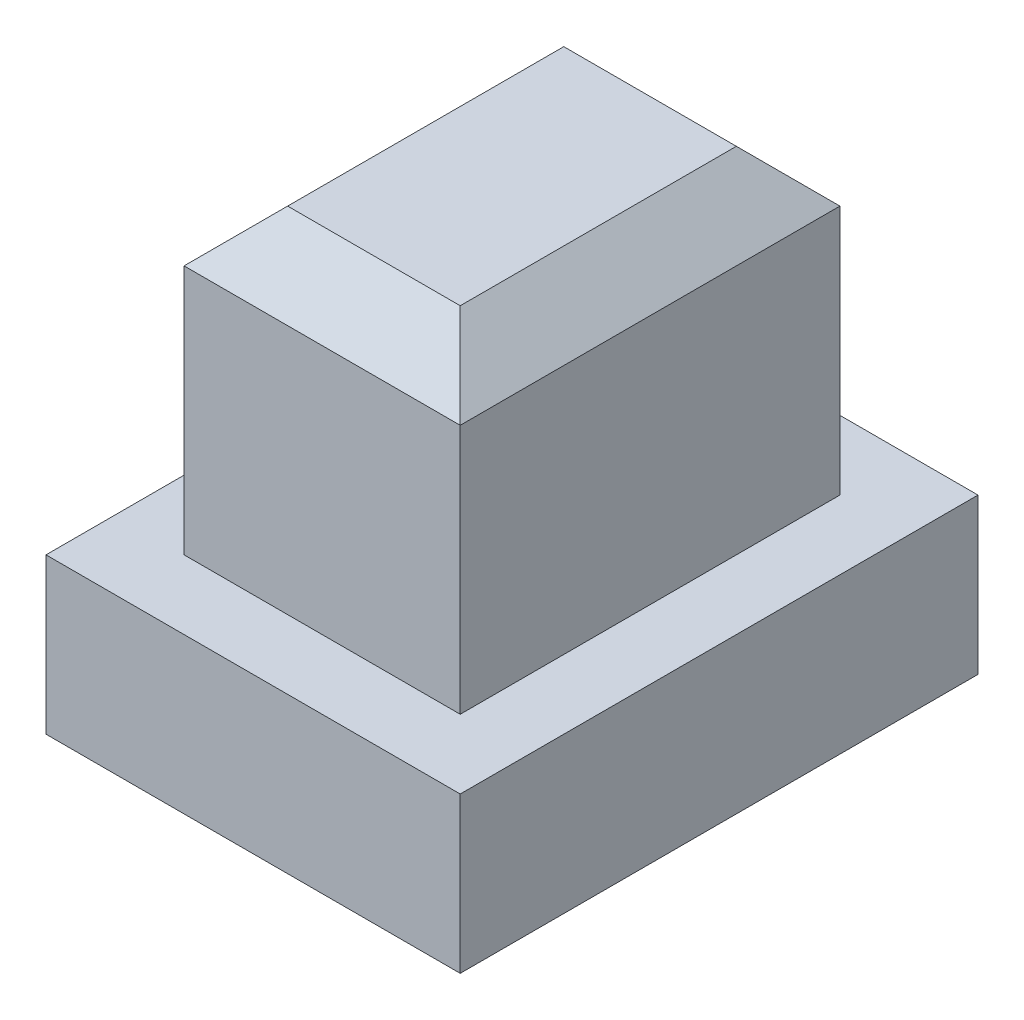
ISO-10303-21;
HEADER;
FILE_DESCRIPTION(('STEP AP214'),'2;1');
FILE_NAME('part.step','',(''),(''),'','','');
FILE_SCHEMA(('AUTOMOTIVE_DESIGN { 1 0 10303 214 1 1 1 1 }'));
ENDSEC;
DATA;
#1=APPLICATION_CONTEXT('core data for automotive mechanical design processes');
#2=APPLICATION_PROTOCOL_DEFINITION('international standard','automotive_design',2000,#1);
#3=PRODUCT_CONTEXT('',#1,'mechanical');
#4=PRODUCT('Part','Part','',(#3));
#5=PRODUCT_RELATED_PRODUCT_CATEGORY('part','',(#4));
#6=PRODUCT_DEFINITION_FORMATION('','',#4);
#7=PRODUCT_DEFINITION_CONTEXT('part definition',#1,'design');
#8=PRODUCT_DEFINITION('design','',#6,#7);
#9=PRODUCT_DEFINITION_SHAPE('','',#8);
#10=(LENGTH_UNIT() NAMED_UNIT(*) SI_UNIT(.MILLI.,.METRE.));
#11=(NAMED_UNIT(*) PLANE_ANGLE_UNIT() SI_UNIT($,.RADIAN.));
#12=(NAMED_UNIT(*) SI_UNIT($,.STERADIAN.) SOLID_ANGLE_UNIT());
#13=UNCERTAINTY_MEASURE_WITH_UNIT(LENGTH_MEASURE(1.E-05),#10,'distance_accuracy_value','');
#14=(GEOMETRIC_REPRESENTATION_CONTEXT(3) GLOBAL_UNCERTAINTY_ASSIGNED_CONTEXT((#13)) GLOBAL_UNIT_ASSIGNED_CONTEXT((#10,
#11,#12)) REPRESENTATION_CONTEXT('',''));
#15=CARTESIAN_POINT('',(0.,0.,0.));
#16=DIRECTION('',(0.,0.,1.));
#17=DIRECTION('',(1.,0.,0.));
#18=AXIS2_PLACEMENT_3D('',#15,#16,#17);
#19=CARTESIAN_POINT('',(-0.212621359223295,1.8,-4.04368932038835));
#20=DIRECTION('',(1.,0.,0.));
#21=DIRECTION('',(0.,0.,-1.));
#22=AXIS2_PLACEMENT_3D('',#19,#20,#21);
#23=PLANE('',#22);
#24=DIRECTION('',(0.,0.,1.));
#25=VECTOR('',#24,1.);
#26=CARTESIAN_POINT('',(-0.212621359223295,0.,-4.04368932038835));
#27=LINE('',#26,#25);
#28=CARTESIAN_POINT('',(-0.212621359223295,0.,-4.04368932038835));
#29=VERTEX_POINT('',#28);
#30=CARTESIAN_POINT('',(-0.212621359223294,0.,1.95631067961165));
#31=VERTEX_POINT('',#30);
#32=EDGE_CURVE('E147',#29,#31,#27,.T.);
#33=ORIENTED_EDGE('',*,*,#32,.T.);
#34=DIRECTION('',(0.,-1.,0.));
#35=VECTOR('',#34,1.);
#36=CARTESIAN_POINT('',(-0.212621359223294,1.8,1.95631067961165));
#37=LINE('',#36,#35);
#38=CARTESIAN_POINT('',(-0.212621359223294,1.8,1.95631067961165));
#39=VERTEX_POINT('',#38);
#40=EDGE_CURVE('E174',#39,#31,#37,.T.);
#41=ORIENTED_EDGE('',*,*,#40,.F.);
#42=DIRECTION('',(0.,0.,1.));
#43=VECTOR('',#42,1.);
#44=CARTESIAN_POINT('',(-0.212621359223295,1.8,-4.04368932038835));
#45=LINE('',#44,#43);
#46=CARTESIAN_POINT('',(-0.212621359223295,1.8,-4.04368932038835));
#47=VERTEX_POINT('',#46);
#48=EDGE_CURVE('E148',#47,#39,#45,.T.);
#49=ORIENTED_EDGE('',*,*,#48,.F.);
#50=DIRECTION('',(0.,-1.,0.));
#51=VECTOR('',#50,1.);
#52=CARTESIAN_POINT('',(-0.212621359223295,1.8,-4.04368932038835));
#53=LINE('',#52,#51);
#54=EDGE_CURVE('E158',#47,#29,#53,.T.);
#55=ORIENTED_EDGE('',*,*,#54,.T.);
#56=EDGE_LOOP('',(#33,#41,#49,#55));
#57=FACE_BOUND('',#56,.T.);
#58=ADVANCED_FACE('F41',(#57),#23,.F.);
#59=CARTESIAN_POINT('',(-0.212621359223294,1.8,1.95631067961165));
#60=DIRECTION('',(0.,0.,-1.));
#61=DIRECTION('',(-1.,0.,0.));
#62=AXIS2_PLACEMENT_3D('',#59,#60,#61);
#63=PLANE('',#62);
#64=DIRECTION('',(1.,0.,0.));
#65=VECTOR('',#64,1.);
#66=CARTESIAN_POINT('',(-0.212621359223294,0.,1.95631067961165));
#67=LINE('',#66,#65);
#68=CARTESIAN_POINT('',(4.58737864077671,0.,1.95631067961165));
#69=VERTEX_POINT('',#68);
#70=EDGE_CURVE('E161',#31,#69,#67,.T.);
#71=ORIENTED_EDGE('',*,*,#70,.T.);
#72=DIRECTION('',(0.,-1.,0.));
#73=VECTOR('',#72,1.);
#74=CARTESIAN_POINT('',(4.58737864077671,1.8,1.95631067961165));
#75=LINE('',#74,#73);
#76=CARTESIAN_POINT('',(4.58737864077671,1.8,1.95631067961165));
#77=VERTEX_POINT('',#76);
#78=EDGE_CURVE('E171',#77,#69,#75,.T.);
#79=ORIENTED_EDGE('',*,*,#78,.F.);
#80=DIRECTION('',(1.,0.,0.));
#81=VECTOR('',#80,1.);
#82=CARTESIAN_POINT('',(-0.212621359223294,1.8,1.95631067961165));
#83=LINE('',#82,#81);
#84=EDGE_CURVE('E151',#39,#77,#83,.T.);
#85=ORIENTED_EDGE('',*,*,#84,.F.);
#86=ORIENTED_EDGE('',*,*,#40,.T.);
#87=EDGE_LOOP('',(#71,#79,#85,#86));
#88=FACE_BOUND('',#87,.T.);
#89=ADVANCED_FACE('F229',(#88),#63,.F.);
#90=CARTESIAN_POINT('',(4.5873786407767,1.8,-4.04368932038835));
#91=DIRECTION('',(-1.,0.,0.));
#92=DIRECTION('',(0.,0.,1.));
#93=AXIS2_PLACEMENT_3D('',#90,#91,#92);
#94=PLANE('',#93);
#95=DIRECTION('',(0.,0.,-1.));
#96=VECTOR('',#95,1.);
#97=CARTESIAN_POINT('',(4.5873786407767,0.,-4.04368932038835));
#98=LINE('',#97,#96);
#99=CARTESIAN_POINT('',(4.5873786407767,0.,-4.04368932038835));
#100=VERTEX_POINT('',#99);
#101=EDGE_CURVE('E163',#69,#100,#98,.T.);
#102=ORIENTED_EDGE('',*,*,#101,.T.);
#103=DIRECTION('',(0.,-1.,0.));
#104=VECTOR('',#103,1.);
#105=CARTESIAN_POINT('',(4.5873786407767,1.8,-4.04368932038835));
#106=LINE('',#105,#104);
#107=CARTESIAN_POINT('',(4.5873786407767,1.8,-4.04368932038835));
#108=VERTEX_POINT('',#107);
#109=EDGE_CURVE('E168',#108,#100,#106,.T.);
#110=ORIENTED_EDGE('',*,*,#109,.F.);
#111=DIRECTION('',(0.,0.,-1.));
#112=VECTOR('',#111,1.);
#113=CARTESIAN_POINT('',(4.5873786407767,1.8,-4.04368932038835));
#114=LINE('',#113,#112);
#115=EDGE_CURVE('E154',#77,#108,#114,.T.);
#116=ORIENTED_EDGE('',*,*,#115,.F.);
#117=ORIENTED_EDGE('',*,*,#78,.T.);
#118=EDGE_LOOP('',(#102,#110,#116,#117));
#119=FACE_BOUND('',#118,.T.);
#120=ADVANCED_FACE('F235',(#119),#94,.F.);
#121=CARTESIAN_POINT('',(-0.212621359223295,1.8,-4.04368932038835));
#122=DIRECTION('',(0.,0.,1.));
#123=DIRECTION('',(1.,0.,0.));
#124=AXIS2_PLACEMENT_3D('',#121,#122,#123);
#125=PLANE('',#124);
#126=DIRECTION('',(-1.,0.,0.));
#127=VECTOR('',#126,1.);
#128=CARTESIAN_POINT('',(-0.212621359223295,0.,-4.04368932038835));
#129=LINE('',#128,#127);
#130=EDGE_CURVE('E152',#100,#29,#129,.T.);
#131=ORIENTED_EDGE('',*,*,#130,.T.);
#132=ORIENTED_EDGE('',*,*,#54,.F.);
#133=DIRECTION('',(-1.,0.,0.));
#134=VECTOR('',#133,1.);
#135=CARTESIAN_POINT('',(-0.212621359223295,1.8,-4.04368932038835));
#136=LINE('',#135,#134);
#137=EDGE_CURVE('E156',#108,#47,#136,.T.);
#138=ORIENTED_EDGE('',*,*,#137,.F.);
#139=ORIENTED_EDGE('',*,*,#109,.T.);
#140=EDGE_LOOP('',(#131,#132,#138,#139));
#141=FACE_BOUND('',#140,.T.);
#142=ADVANCED_FACE('F344',(#141),#125,.F.);
#143=CARTESIAN_POINT('',(0.,1.8,0.));
#144=DIRECTION('',(0.,1.,0.));
#145=DIRECTION('',(0.,0.,1.));
#146=AXIS2_PLACEMENT_3D('',#143,#144,#145);
#147=PLANE('',#146);
#148=DIRECTION('',(-1.,0.,0.));
#149=VECTOR('',#148,1.);
#150=CARTESIAN_POINT('',(3.7873786407767,1.8,-3.24368932038835));
#151=LINE('',#150,#149);
#152=CARTESIAN_POINT('',(3.7873786407767,1.8,-3.24368932038835));
#153=VERTEX_POINT('',#152);
#154=CARTESIAN_POINT('',(0.587378640776705,1.8,-3.24368932038835));
#155=VERTEX_POINT('',#154);
#156=EDGE_CURVE('E138',#153,#155,#151,.T.);
#157=ORIENTED_EDGE('',*,*,#156,.F.);
#158=DIRECTION('',(0.,0.,-1.));
#159=VECTOR('',#158,1.);
#160=CARTESIAN_POINT('',(3.78737864077671,1.8,1.15631067961165));
#161=LINE('',#160,#159);
#162=CARTESIAN_POINT('',(3.78737864077671,1.8,1.15631067961165));
#163=VERTEX_POINT('',#162);
#164=EDGE_CURVE('E135',#163,#153,#161,.T.);
#165=ORIENTED_EDGE('',*,*,#164,.F.);
#166=DIRECTION('',(1.,0.,0.));
#167=VECTOR('',#166,1.);
#168=CARTESIAN_POINT('',(0.587378640776706,1.8,1.15631067961165));
#169=LINE('',#168,#167);
#170=CARTESIAN_POINT('',(0.587378640776706,1.8,1.15631067961165));
#171=VERTEX_POINT('',#170);
#172=EDGE_CURVE('E121',#171,#163,#169,.T.);
#173=ORIENTED_EDGE('',*,*,#172,.F.);
#174=DIRECTION('',(0.,0.,1.));
#175=VECTOR('',#174,1.);
#176=CARTESIAN_POINT('',(0.587378640776705,1.8,-3.24368932038835));
#177=LINE('',#176,#175);
#178=EDGE_CURVE('E132',#155,#171,#177,.T.);
#179=ORIENTED_EDGE('',*,*,#178,.F.);
#180=EDGE_LOOP('',(#157,#165,#173,#179));
#181=FACE_BOUND('',#180,.T.);
#182=ORIENTED_EDGE('',*,*,#48,.T.);
#183=ORIENTED_EDGE('',*,*,#84,.T.);
#184=ORIENTED_EDGE('',*,*,#115,.T.);
#185=ORIENTED_EDGE('',*,*,#137,.T.);
#186=EDGE_LOOP('',(#182,#183,#184,#185));
#187=FACE_BOUND('',#186,.T.);
#188=ADVANCED_FACE('F130',(#181,#187),#147,.T.);
#189=CARTESIAN_POINT('',(0.,0.,0.));
#190=DIRECTION('',(0.,1.,0.));
#191=DIRECTION('',(0.,0.,1.));
#192=AXIS2_PLACEMENT_3D('',#189,#190,#191);
#193=PLANE('',#192);
#194=ORIENTED_EDGE('',*,*,#32,.F.);
#195=ORIENTED_EDGE('',*,*,#130,.F.);
#196=ORIENTED_EDGE('',*,*,#101,.F.);
#197=ORIENTED_EDGE('',*,*,#70,.F.);
#198=EDGE_LOOP('',(#194,#195,#196,#197));
#199=FACE_BOUND('',#198,.T.);
#200=ADVANCED_FACE('F323',(#199),#193,.F.);
#201=CARTESIAN_POINT('',(3.7873786407767,5.3,-3.24368932038835));
#202=DIRECTION('',(0.,0.,1.));
#203=DIRECTION('',(1.,0.,0.));
#204=AXIS2_PLACEMENT_3D('',#201,#202,#203);
#205=PLANE('',#204);
#206=DIRECTION('',(0.,-1.,0.));
#207=VECTOR('',#206,1.);
#208=CARTESIAN_POINT('',(0.587378640776705,5.3,-3.24368932038835));
#209=LINE('',#208,#207);
#210=CARTESIAN_POINT('',(0.587378640776705,4.7,-3.24368932038835));
#211=VERTEX_POINT('',#210);
#212=EDGE_CURVE('E123',#211,#155,#209,.T.);
#213=ORIENTED_EDGE('',*,*,#212,.F.);
#214=DIRECTION('',(1.,0.,0.));
#215=VECTOR('',#214,1.);
#216=CARTESIAN_POINT('',(3.7873786407767,4.7,-3.24368932038835));
#217=LINE('',#216,#215);
#218=CARTESIAN_POINT('',(3.7873786407767,4.7,-3.24368932038835));
#219=VERTEX_POINT('',#218);
#220=EDGE_CURVE('E11',#211,#219,#217,.T.);
#221=ORIENTED_EDGE('',*,*,#220,.T.);
#222=DIRECTION('',(0.,-1.,0.));
#223=VECTOR('',#222,1.);
#224=CARTESIAN_POINT('',(3.7873786407767,5.3,-3.24368932038835));
#225=LINE('',#224,#223);
#226=EDGE_CURVE('E143',#219,#153,#225,.T.);
#227=ORIENTED_EDGE('',*,*,#226,.T.);
#228=ORIENTED_EDGE('',*,*,#156,.T.);
#229=EDGE_LOOP('',(#213,#221,#227,#228));
#230=FACE_BOUND('',#229,.T.);
#231=ADVANCED_FACE('F212',(#230),#205,.F.);
#232=CARTESIAN_POINT('',(0.587378640776705,5.3,-3.24368932038835));
#233=DIRECTION('',(1.,0.,0.));
#234=DIRECTION('',(0.,0.,-1.));
#235=AXIS2_PLACEMENT_3D('',#232,#233,#234);
#236=PLANE('',#235);
#237=DIRECTION('',(0.,-1.,0.));
#238=VECTOR('',#237,1.);
#239=CARTESIAN_POINT('',(0.587378640776706,5.3,1.15631067961165));
#240=LINE('',#239,#238);
#241=CARTESIAN_POINT('',(0.587378640776706,4.7,1.15631067961165));
#242=VERTEX_POINT('',#241);
#243=EDGE_CURVE('E118',#242,#171,#240,.T.);
#244=ORIENTED_EDGE('',*,*,#243,.F.);
#245=DIRECTION('',(0.,0.,-1.));
#246=VECTOR('',#245,1.);
#247=CARTESIAN_POINT('',(0.587378640776705,4.7,-3.24368932038835));
#248=LINE('',#247,#246);
#249=EDGE_CURVE('E51',#242,#211,#248,.T.);
#250=ORIENTED_EDGE('',*,*,#249,.T.);
#251=ORIENTED_EDGE('',*,*,#212,.T.);
#252=ORIENTED_EDGE('',*,*,#178,.T.);
#253=EDGE_LOOP('',(#244,#250,#251,#252));
#254=FACE_BOUND('',#253,.T.);
#255=ADVANCED_FACE('F137',(#254),#236,.F.);
#256=CARTESIAN_POINT('',(0.587378640776706,5.3,1.15631067961165));
#257=DIRECTION('',(0.,0.,-1.));
#258=DIRECTION('',(-1.,0.,0.));
#259=AXIS2_PLACEMENT_3D('',#256,#257,#258);
#260=PLANE('',#259);
#261=DIRECTION('',(0.,-1.,0.));
#262=VECTOR('',#261,1.);
#263=CARTESIAN_POINT('',(3.78737864077671,5.3,1.15631067961165));
#264=LINE('',#263,#262);
#265=CARTESIAN_POINT('',(3.78737864077671,4.7,1.15631067961165));
#266=VERTEX_POINT('',#265);
#267=EDGE_CURVE('E124',#266,#163,#264,.T.);
#268=ORIENTED_EDGE('',*,*,#267,.F.);
#269=DIRECTION('',(-1.,0.,0.));
#270=VECTOR('',#269,1.);
#271=CARTESIAN_POINT('',(0.587378640776706,4.7,1.15631067961165));
#272=LINE('',#271,#270);
#273=EDGE_CURVE('E66',#266,#242,#272,.T.);
#274=ORIENTED_EDGE('',*,*,#273,.T.);
#275=ORIENTED_EDGE('',*,*,#243,.T.);
#276=ORIENTED_EDGE('',*,*,#172,.T.);
#277=EDGE_LOOP('',(#268,#274,#275,#276));
#278=FACE_BOUND('',#277,.T.);
#279=ADVANCED_FACE('F120',(#278),#260,.F.);
#280=CARTESIAN_POINT('',(3.78737864077671,5.3,1.15631067961165));
#281=DIRECTION('',(-1.,0.,0.));
#282=DIRECTION('',(0.,0.,1.));
#283=AXIS2_PLACEMENT_3D('',#280,#281,#282);
#284=PLANE('',#283);
#285=ORIENTED_EDGE('',*,*,#226,.F.);
#286=DIRECTION('',(0.,0.,1.));
#287=VECTOR('',#286,1.);
#288=CARTESIAN_POINT('',(3.78737864077671,4.7,1.15631067961165));
#289=LINE('',#288,#287);
#290=EDGE_CURVE('E186',#219,#266,#289,.T.);
#291=ORIENTED_EDGE('',*,*,#290,.T.);
#292=ORIENTED_EDGE('',*,*,#267,.T.);
#293=ORIENTED_EDGE('',*,*,#164,.T.);
#294=EDGE_LOOP('',(#285,#291,#292,#293));
#295=FACE_BOUND('',#294,.T.);
#296=ADVANCED_FACE('F215',(#295),#284,.F.);
#297=CARTESIAN_POINT('',(0.,5.3,0.));
#298=DIRECTION('',(0.,1.,0.));
#299=DIRECTION('',(0.,0.,1.));
#300=AXIS2_PLACEMENT_3D('',#297,#298,#299);
#301=PLANE('',#300);
#302=DIRECTION('',(1.,0.,0.));
#303=VECTOR('',#302,1.);
#304=CARTESIAN_POINT('',(3.78737864077671,5.3,0.556310679611652));
#305=LINE('',#304,#303);
#306=CARTESIAN_POINT('',(1.1873786407767,5.3,0.556310679611652));
#307=VERTEX_POINT('',#306);
#308=CARTESIAN_POINT('',(3.18737864077671,5.3,0.556310679611652));
#309=VERTEX_POINT('',#308);
#310=EDGE_CURVE('E181',#307,#309,#305,.T.);
#311=ORIENTED_EDGE('',*,*,#310,.T.);
#312=DIRECTION('',(0.,0.,-1.));
#313=VECTOR('',#312,1.);
#314=CARTESIAN_POINT('',(3.18737864077671,5.3,-3.24368932038835));
#315=LINE('',#314,#313);
#316=CARTESIAN_POINT('',(3.18737864077671,5.3,-2.64368932038835));
#317=VERTEX_POINT('',#316);
#318=EDGE_CURVE('E183',#309,#317,#315,.T.);
#319=ORIENTED_EDGE('',*,*,#318,.T.);
#320=DIRECTION('',(-1.,0.,0.));
#321=VECTOR('',#320,1.);
#322=CARTESIAN_POINT('',(0.587378640776705,5.3,-2.64368932038835));
#323=LINE('',#322,#321);
#324=CARTESIAN_POINT('',(1.1873786407767,5.3,-2.64368932038835));
#325=VERTEX_POINT('',#324);
#326=EDGE_CURVE('E177',#317,#325,#323,.T.);
#327=ORIENTED_EDGE('',*,*,#326,.T.);
#328=DIRECTION('',(0.,0.,1.));
#329=VECTOR('',#328,1.);
#330=CARTESIAN_POINT('',(1.1873786407767,5.3,1.15631067961165));
#331=LINE('',#330,#329);
#332=EDGE_CURVE('E179',#325,#307,#331,.T.);
#333=ORIENTED_EDGE('',*,*,#332,.T.);
#334=EDGE_LOOP('',(#311,#319,#327,#333));
#335=FACE_BOUND('',#334,.T.);
#336=ADVANCED_FACE('F220',(#335),#301,.T.);
#337=CARTESIAN_POINT('',(1.1873786407767,5.3,0.));
#338=DIRECTION('',(-0.707106781186549,0.707106781186546,0.));
#339=DIRECTION('',(0.,0.,-1.));
#340=AXIS2_PLACEMENT_3D('',#337,#338,#339);
#341=PLANE('',#340);
#342=DIRECTION('',(0.577350269189625,0.577350269189627,0.577350269189625));
#343=VECTOR('',#342,1.);
#344=CARTESIAN_POINT('',(0.791585760517804,4.9042071197411,-3.03948220064725));
#345=LINE('',#344,#343);
#346=EDGE_CURVE('E194',#211,#325,#345,.T.);
#347=ORIENTED_EDGE('',*,*,#346,.F.);
#348=ORIENTED_EDGE('',*,*,#249,.F.);
#349=DIRECTION('',(0.577350269189625,0.577350269189627,-0.577350269189625));
#350=VECTOR('',#349,1.);
#351=CARTESIAN_POINT('',(1.37281553398059,5.48543689320389,0.370873786407769));
#352=LINE('',#351,#350);
#353=EDGE_CURVE('E46',#307,#242,#352,.F.);
#354=ORIENTED_EDGE('',*,*,#353,.F.);
#355=ORIENTED_EDGE('',*,*,#332,.F.);
#356=EDGE_LOOP('',(#347,#348,#354,#355));
#357=FACE_BOUND('',#356,.T.);
#358=ADVANCED_FACE('F44',(#357),#341,.T.);
#359=CARTESIAN_POINT('',(0.,5.3,0.556310679611652));
#360=DIRECTION('',(0.,0.707106781186546,0.707106781186549));
#361=DIRECTION('',(-1.,0.,0.));
#362=AXIS2_PLACEMENT_3D('',#359,#360,#361);
#363=PLANE('',#362);
#364=ORIENTED_EDGE('',*,*,#353,.T.);
#365=ORIENTED_EDGE('',*,*,#273,.F.);
#366=DIRECTION('',(-0.577350269189626,0.577350269189627,-0.577350269189625));
#367=VECTOR('',#366,1.);
#368=CARTESIAN_POINT('',(2.12491909385114,6.36245954692557,-0.506148867313914));
#369=LINE('',#368,#367);
#370=EDGE_CURVE('E193',#309,#266,#369,.F.);
#371=ORIENTED_EDGE('',*,*,#370,.F.);
#372=ORIENTED_EDGE('',*,*,#310,.F.);
#373=EDGE_LOOP('',(#364,#365,#371,#372));
#374=FACE_BOUND('',#373,.T.);
#375=ADVANCED_FACE('F204',(#374),#363,.T.);
#376=CARTESIAN_POINT('',(0.,5.3,-2.64368932038835));
#377=DIRECTION('',(0.,0.707106781186546,-0.707106781186549));
#378=DIRECTION('',(1.,0.,0.));
#379=AXIS2_PLACEMENT_3D('',#376,#377,#378);
#380=PLANE('',#379);
#381=ORIENTED_EDGE('',*,*,#346,.T.);
#382=ORIENTED_EDGE('',*,*,#326,.F.);
#383=DIRECTION('',(0.577350269189626,-0.577350269189627,-0.577350269189625));
#384=VECTOR('',#383,1.);
#385=CARTESIAN_POINT('',(2.12491909385114,6.36245954692557,-1.58122977346278));
#386=LINE('',#385,#384);
#387=EDGE_CURVE('E191',#219,#317,#386,.F.);
#388=ORIENTED_EDGE('',*,*,#387,.F.);
#389=ORIENTED_EDGE('',*,*,#220,.F.);
#390=EDGE_LOOP('',(#381,#382,#388,#389));
#391=FACE_BOUND('',#390,.T.);
#392=ADVANCED_FACE('F209',(#391),#380,.T.);
#393=CARTESIAN_POINT('',(3.18737864077671,5.3,0.));
#394=DIRECTION('',(0.707106781186548,0.707106781186547,0.));
#395=DIRECTION('',(0.,0.,1.));
#396=AXIS2_PLACEMENT_3D('',#393,#394,#395);
#397=PLANE('',#396);
#398=ORIENTED_EDGE('',*,*,#370,.T.);
#399=ORIENTED_EDGE('',*,*,#290,.F.);
#400=ORIENTED_EDGE('',*,*,#387,.T.);
#401=ORIENTED_EDGE('',*,*,#318,.F.);
#402=EDGE_LOOP('',(#398,#399,#400,#401));
#403=FACE_BOUND('',#402,.T.);
#404=ADVANCED_FACE('F217',(#403),#397,.T.);
#405=CLOSED_SHELL('',(#58,#89,#120,#142,#188,#200,#231,#255,#279,#296,#336,#358,#375,#392,#404));
#406=MANIFOLD_SOLID_BREP('B2',#405);
#407=ADVANCED_BREP_SHAPE_REPRESENTATION('',(#18,#406),#14);
#408=SHAPE_DEFINITION_REPRESENTATION(#9,#407);
ENDSEC;
END-ISO-10303-21;
